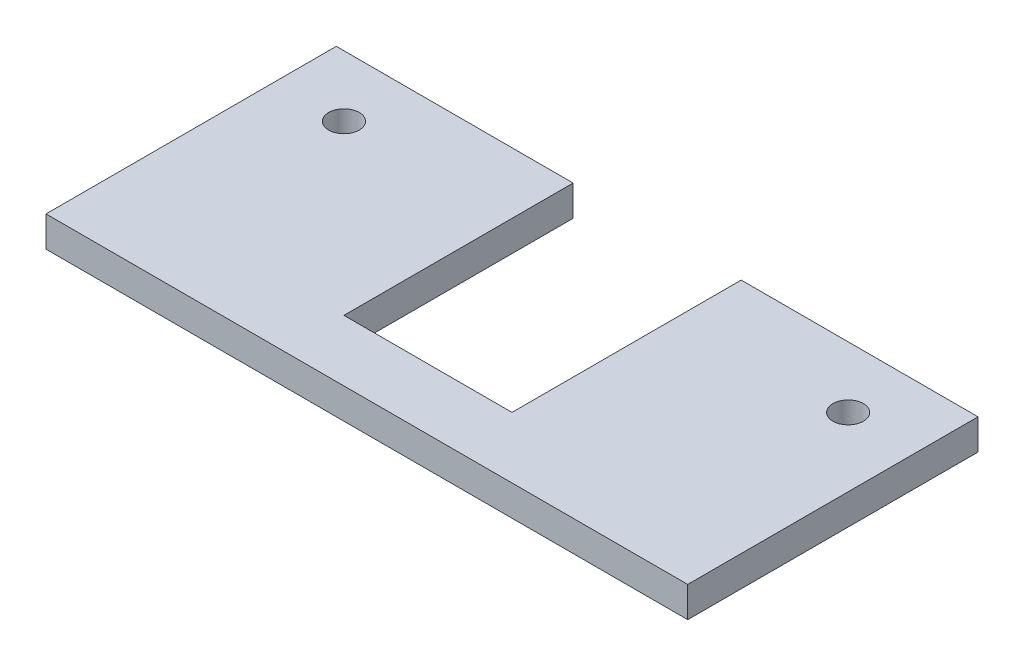
ISO-10303-21;
HEADER;
FILE_DESCRIPTION(('STEP AP214'),'2;1');
FILE_NAME('part.step','',(''),(''),'','','');
FILE_SCHEMA(('AUTOMOTIVE_DESIGN { 1 0 10303 214 1 1 1 1 }'));
ENDSEC;
DATA;
#1=APPLICATION_CONTEXT('core data for automotive mechanical design processes');
#2=APPLICATION_PROTOCOL_DEFINITION('international standard','automotive_design',2000,#1);
#3=PRODUCT_CONTEXT('',#1,'mechanical');
#4=PRODUCT('Part','Part','',(#3));
#5=PRODUCT_RELATED_PRODUCT_CATEGORY('part','',(#4));
#6=PRODUCT_DEFINITION_FORMATION('','',#4);
#7=PRODUCT_DEFINITION_CONTEXT('part definition',#1,'design');
#8=PRODUCT_DEFINITION('design','',#6,#7);
#9=PRODUCT_DEFINITION_SHAPE('','',#8);
#10=(LENGTH_UNIT() NAMED_UNIT(*) SI_UNIT(.MILLI.,.METRE.));
#11=(NAMED_UNIT(*) PLANE_ANGLE_UNIT() SI_UNIT($,.RADIAN.));
#12=(NAMED_UNIT(*) SI_UNIT($,.STERADIAN.) SOLID_ANGLE_UNIT());
#13=UNCERTAINTY_MEASURE_WITH_UNIT(LENGTH_MEASURE(1.E-05),#10,'distance_accuracy_value','');
#14=(GEOMETRIC_REPRESENTATION_CONTEXT(3) GLOBAL_UNCERTAINTY_ASSIGNED_CONTEXT((#13)) GLOBAL_UNIT_ASSIGNED_CONTEXT((#10,
#11,#12)) REPRESENTATION_CONTEXT('',''));
#15=CARTESIAN_POINT('',(0.,0.,0.));
#16=DIRECTION('',(0.,0.,1.));
#17=DIRECTION('',(1.,0.,0.));
#18=AXIS2_PLACEMENT_3D('',#15,#16,#17);
#19=CARTESIAN_POINT('',(0.,2.,0.));
#20=DIRECTION('',(0.,1.,0.));
#21=DIRECTION('',(0.,0.,1.));
#22=AXIS2_PLACEMENT_3D('',#19,#20,#21);
#23=PLANE('',#22);
#24=CARTESIAN_POINT('',(0.,2.,0.));
#25=DIRECTION('',(0.,1.,0.));
#26=DIRECTION('',(0.,0.,1.));
#27=AXIS2_PLACEMENT_3D('',#24,#25,#26);
#28=CIRCLE('',#27,1.);
#29=CARTESIAN_POINT('',(0.,2.,1.));
#30=VERTEX_POINT('',#29);
#31=EDGE_CURVE('E139',#30,#30,#28,.T.);
#32=ORIENTED_EDGE('',*,*,#31,.F.);
#33=EDGE_LOOP('',(#32));
#34=FACE_BOUND('',#33,.T.);
#35=DIRECTION('',(0.,0.,-1.));
#36=VECTOR('',#35,1.);
#37=CARTESIAN_POINT('',(11.,2.,0.));
#38=LINE('',#37,#36);
#39=CARTESIAN_POINT('',(11.,2.,11.));
#40=VERTEX_POINT('',#39);
#41=CARTESIAN_POINT('',(11.,2.,-4.));
#42=VERTEX_POINT('',#41);
#43=EDGE_CURVE('E52',#40,#42,#38,.T.);
#44=ORIENTED_EDGE('',*,*,#43,.T.);
#45=DIRECTION('',(-1.,0.,0.));
#46=VECTOR('',#45,1.);
#47=CARTESIAN_POINT('',(11.,2.,-4.));
#48=LINE('',#47,#46);
#49=CARTESIAN_POINT('',(-4.5,2.,-4.));
#50=VERTEX_POINT('',#49);
#51=EDGE_CURVE('E95',#42,#50,#48,.T.);
#52=ORIENTED_EDGE('',*,*,#51,.T.);
#53=DIRECTION('',(0.,0.,1.));
#54=VECTOR('',#53,1.);
#55=CARTESIAN_POINT('',(-4.5,2.,-4.));
#56=LINE('',#55,#54);
#57=CARTESIAN_POINT('',(-4.5,2.,15.));
#58=VERTEX_POINT('',#57);
#59=EDGE_CURVE('E164',#50,#58,#56,.T.);
#60=ORIENTED_EDGE('',*,*,#59,.T.);
#61=DIRECTION('',(1.,0.,0.));
#62=VECTOR('',#61,1.);
#63=CARTESIAN_POINT('',(-4.5,2.,15.));
#64=LINE('',#63,#62);
#65=CARTESIAN_POINT('',(37.5,2.,15.));
#66=VERTEX_POINT('',#65);
#67=EDGE_CURVE('E178',#58,#66,#64,.T.);
#68=ORIENTED_EDGE('',*,*,#67,.T.);
#69=DIRECTION('',(0.,0.,-1.));
#70=VECTOR('',#69,1.);
#71=CARTESIAN_POINT('',(37.5,2.,15.));
#72=LINE('',#71,#70);
#73=CARTESIAN_POINT('',(37.5,2.,-4.));
#74=VERTEX_POINT('',#73);
#75=EDGE_CURVE('E115',#66,#74,#72,.T.);
#76=ORIENTED_EDGE('',*,*,#75,.T.);
#77=DIRECTION('',(-1.,0.,0.));
#78=VECTOR('',#77,1.);
#79=CARTESIAN_POINT('',(37.5,2.,-4.));
#80=LINE('',#79,#78);
#81=CARTESIAN_POINT('',(22.,2.,-4.));
#82=VERTEX_POINT('',#81);
#83=EDGE_CURVE('E109',#74,#82,#80,.T.);
#84=ORIENTED_EDGE('',*,*,#83,.T.);
#85=DIRECTION('',(0.,0.,1.));
#86=VECTOR('',#85,1.);
#87=CARTESIAN_POINT('',(22.,2.,-4.));
#88=LINE('',#87,#86);
#89=CARTESIAN_POINT('',(22.,2.,11.));
#90=VERTEX_POINT('',#89);
#91=EDGE_CURVE('E113',#82,#90,#88,.T.);
#92=ORIENTED_EDGE('',*,*,#91,.T.);
#93=DIRECTION('',(-1.,0.,0.));
#94=VECTOR('',#93,1.);
#95=CARTESIAN_POINT('',(11.,2.,11.));
#96=LINE('',#95,#94);
#97=EDGE_CURVE('E130',#90,#40,#96,.T.);
#98=ORIENTED_EDGE('',*,*,#97,.T.);
#99=EDGE_LOOP('',(#44,#52,#60,#68,#76,#84,#92,#98));
#100=FACE_BOUND('',#99,.T.);
#101=CARTESIAN_POINT('',(33.,2.,0.));
#102=DIRECTION('',(0.,1.,0.));
#103=DIRECTION('',(0.,0.,1.));
#104=AXIS2_PLACEMENT_3D('',#101,#102,#103);
#105=CIRCLE('',#104,0.999999999999998);
#106=CARTESIAN_POINT('',(33.,2.,0.999999999999998));
#107=VERTEX_POINT('',#106);
#108=EDGE_CURVE('E187',#107,#107,#105,.T.);
#109=ORIENTED_EDGE('',*,*,#108,.F.);
#110=EDGE_LOOP('',(#109));
#111=FACE_BOUND('',#110,.T.);
#112=ADVANCED_FACE('F35',(#34,#100,#111),#23,.T.);
#113=CARTESIAN_POINT('',(0.,0.,0.));
#114=DIRECTION('',(0.,1.,0.));
#115=DIRECTION('',(0.,0.,1.));
#116=AXIS2_PLACEMENT_3D('',#113,#114,#115);
#117=PLANE('',#116);
#118=CARTESIAN_POINT('',(0.,0.,0.));
#119=DIRECTION('',(0.,1.,0.));
#120=DIRECTION('',(0.,0.,1.));
#121=AXIS2_PLACEMENT_3D('',#118,#119,#120);
#122=CIRCLE('',#121,1.);
#123=CARTESIAN_POINT('',(0.,0.,1.));
#124=VERTEX_POINT('',#123);
#125=EDGE_CURVE('E184',#124,#124,#122,.T.);
#126=ORIENTED_EDGE('',*,*,#125,.T.);
#127=EDGE_LOOP('',(#126));
#128=FACE_BOUND('',#127,.T.);
#129=DIRECTION('',(-1.,0.,0.));
#130=VECTOR('',#129,1.);
#131=CARTESIAN_POINT('',(11.,0.,-4.));
#132=LINE('',#131,#130);
#133=CARTESIAN_POINT('',(11.,0.,-4.));
#134=VERTEX_POINT('',#133);
#135=CARTESIAN_POINT('',(-4.5,0.,-4.));
#136=VERTEX_POINT('',#135);
#137=EDGE_CURVE('E136',#134,#136,#132,.T.);
#138=ORIENTED_EDGE('',*,*,#137,.F.);
#139=DIRECTION('',(0.,0.,-1.));
#140=VECTOR('',#139,1.);
#141=CARTESIAN_POINT('',(11.,0.,0.));
#142=LINE('',#141,#140);
#143=CARTESIAN_POINT('',(11.,0.,11.));
#144=VERTEX_POINT('',#143);
#145=EDGE_CURVE('E148',#144,#134,#142,.T.);
#146=ORIENTED_EDGE('',*,*,#145,.F.);
#147=DIRECTION('',(-1.,0.,0.));
#148=VECTOR('',#147,1.);
#149=CARTESIAN_POINT('',(11.,0.,11.));
#150=LINE('',#149,#148);
#151=CARTESIAN_POINT('',(22.,0.,11.));
#152=VERTEX_POINT('',#151);
#153=EDGE_CURVE('E88',#152,#144,#150,.T.);
#154=ORIENTED_EDGE('',*,*,#153,.F.);
#155=DIRECTION('',(0.,0.,1.));
#156=VECTOR('',#155,1.);
#157=CARTESIAN_POINT('',(22.,0.,11.));
#158=LINE('',#157,#156);
#159=CARTESIAN_POINT('',(22.,0.,-4.));
#160=VERTEX_POINT('',#159);
#161=EDGE_CURVE('E81',#160,#152,#158,.T.);
#162=ORIENTED_EDGE('',*,*,#161,.F.);
#163=DIRECTION('',(-1.,0.,0.));
#164=VECTOR('',#163,1.);
#165=CARTESIAN_POINT('',(37.5,0.,-4.));
#166=LINE('',#165,#164);
#167=CARTESIAN_POINT('',(37.5,0.,-4.));
#168=VERTEX_POINT('',#167);
#169=EDGE_CURVE('E124',#168,#160,#166,.T.);
#170=ORIENTED_EDGE('',*,*,#169,.F.);
#171=DIRECTION('',(0.,0.,-1.));
#172=VECTOR('',#171,1.);
#173=CARTESIAN_POINT('',(37.5,0.,15.));
#174=LINE('',#173,#172);
#175=CARTESIAN_POINT('',(37.5,0.,15.));
#176=VERTEX_POINT('',#175);
#177=EDGE_CURVE('E143',#176,#168,#174,.T.);
#178=ORIENTED_EDGE('',*,*,#177,.F.);
#179=DIRECTION('',(1.,0.,0.));
#180=VECTOR('',#179,1.);
#181=CARTESIAN_POINT('',(-4.5,0.,15.));
#182=LINE('',#181,#180);
#183=CARTESIAN_POINT('',(-4.5,0.,15.));
#184=VERTEX_POINT('',#183);
#185=EDGE_CURVE('E141',#184,#176,#182,.T.);
#186=ORIENTED_EDGE('',*,*,#185,.F.);
#187=DIRECTION('',(0.,0.,1.));
#188=VECTOR('',#187,1.);
#189=CARTESIAN_POINT('',(-4.5,0.,-4.));
#190=LINE('',#189,#188);
#191=EDGE_CURVE('E138',#136,#184,#190,.T.);
#192=ORIENTED_EDGE('',*,*,#191,.F.);
#193=EDGE_LOOP('',(#138,#146,#154,#162,#170,#178,#186,#192));
#194=FACE_BOUND('',#193,.T.);
#195=CARTESIAN_POINT('',(33.,0.,0.));
#196=DIRECTION('',(0.,1.,0.));
#197=DIRECTION('',(0.,0.,1.));
#198=AXIS2_PLACEMENT_3D('',#195,#196,#197);
#199=CIRCLE('',#198,0.999999999999998);
#200=CARTESIAN_POINT('',(33.,0.,0.999999999999998));
#201=VERTEX_POINT('',#200);
#202=EDGE_CURVE('E190',#201,#201,#199,.T.);
#203=ORIENTED_EDGE('',*,*,#202,.T.);
#204=EDGE_LOOP('',(#203));
#205=FACE_BOUND('',#204,.T.);
#206=ADVANCED_FACE('F168',(#128,#194,#205),#117,.F.);
#207=CARTESIAN_POINT('',(11.,2.,-4.));
#208=DIRECTION('',(0.,0.,1.));
#209=DIRECTION('',(1.,0.,0.));
#210=AXIS2_PLACEMENT_3D('',#207,#208,#209);
#211=PLANE('',#210);
#212=ORIENTED_EDGE('',*,*,#137,.T.);
#213=DIRECTION('',(0.,-1.,0.));
#214=VECTOR('',#213,1.);
#215=CARTESIAN_POINT('',(-4.5,2.,-4.));
#216=LINE('',#215,#214);
#217=EDGE_CURVE('E44',#50,#136,#216,.T.);
#218=ORIENTED_EDGE('',*,*,#217,.F.);
#219=ORIENTED_EDGE('',*,*,#51,.F.);
#220=DIRECTION('',(0.,-1.,0.));
#221=VECTOR('',#220,1.);
#222=CARTESIAN_POINT('',(11.,2.,-4.));
#223=LINE('',#222,#221);
#224=EDGE_CURVE('E11',#42,#134,#223,.T.);
#225=ORIENTED_EDGE('',*,*,#224,.T.);
#226=EDGE_LOOP('',(#212,#218,#219,#225));
#227=FACE_BOUND('',#226,.T.);
#228=ADVANCED_FACE('F37',(#227),#211,.F.);
#229=CARTESIAN_POINT('',(-4.5,2.,-4.));
#230=DIRECTION('',(1.,0.,0.));
#231=DIRECTION('',(0.,0.,-1.));
#232=AXIS2_PLACEMENT_3D('',#229,#230,#231);
#233=PLANE('',#232);
#234=ORIENTED_EDGE('',*,*,#191,.T.);
#235=DIRECTION('',(0.,-1.,0.));
#236=VECTOR('',#235,1.);
#237=CARTESIAN_POINT('',(-4.5,2.,15.));
#238=LINE('',#237,#236);
#239=EDGE_CURVE('E156',#58,#184,#238,.T.);
#240=ORIENTED_EDGE('',*,*,#239,.F.);
#241=ORIENTED_EDGE('',*,*,#59,.F.);
#242=ORIENTED_EDGE('',*,*,#217,.T.);
#243=EDGE_LOOP('',(#234,#240,#241,#242));
#244=FACE_BOUND('',#243,.T.);
#245=ADVANCED_FACE('F162',(#244),#233,.F.);
#246=CARTESIAN_POINT('',(-4.5,2.,15.));
#247=DIRECTION('',(0.,0.,-1.));
#248=DIRECTION('',(-1.,0.,0.));
#249=AXIS2_PLACEMENT_3D('',#246,#247,#248);
#250=PLANE('',#249);
#251=ORIENTED_EDGE('',*,*,#185,.T.);
#252=DIRECTION('',(0.,-1.,0.));
#253=VECTOR('',#252,1.);
#254=CARTESIAN_POINT('',(37.5,2.,15.));
#255=LINE('',#254,#253);
#256=EDGE_CURVE('E153',#66,#176,#255,.T.);
#257=ORIENTED_EDGE('',*,*,#256,.F.);
#258=ORIENTED_EDGE('',*,*,#67,.F.);
#259=ORIENTED_EDGE('',*,*,#239,.T.);
#260=EDGE_LOOP('',(#251,#257,#258,#259));
#261=FACE_BOUND('',#260,.T.);
#262=ADVANCED_FACE('F174',(#261),#250,.F.);
#263=CARTESIAN_POINT('',(37.5,2.,15.));
#264=DIRECTION('',(-1.,0.,0.));
#265=DIRECTION('',(0.,0.,1.));
#266=AXIS2_PLACEMENT_3D('',#263,#264,#265);
#267=PLANE('',#266);
#268=ORIENTED_EDGE('',*,*,#177,.T.);
#269=DIRECTION('',(0.,-1.,0.));
#270=VECTOR('',#269,1.);
#271=CARTESIAN_POINT('',(37.5,2.,-4.));
#272=LINE('',#271,#270);
#273=EDGE_CURVE('E125',#74,#168,#272,.T.);
#274=ORIENTED_EDGE('',*,*,#273,.F.);
#275=ORIENTED_EDGE('',*,*,#75,.F.);
#276=ORIENTED_EDGE('',*,*,#256,.T.);
#277=EDGE_LOOP('',(#268,#274,#275,#276));
#278=FACE_BOUND('',#277,.T.);
#279=ADVANCED_FACE('F177',(#278),#267,.F.);
#280=CARTESIAN_POINT('',(37.5,2.,-4.));
#281=DIRECTION('',(0.,0.,1.));
#282=DIRECTION('',(1.,0.,0.));
#283=AXIS2_PLACEMENT_3D('',#280,#281,#282);
#284=PLANE('',#283);
#285=ORIENTED_EDGE('',*,*,#169,.T.);
#286=DIRECTION('',(0.,-1.,0.));
#287=VECTOR('',#286,1.);
#288=CARTESIAN_POINT('',(22.,2.,-4.));
#289=LINE('',#288,#287);
#290=EDGE_CURVE('E121',#82,#160,#289,.T.);
#291=ORIENTED_EDGE('',*,*,#290,.F.);
#292=ORIENTED_EDGE('',*,*,#83,.F.);
#293=ORIENTED_EDGE('',*,*,#273,.T.);
#294=EDGE_LOOP('',(#285,#291,#292,#293));
#295=FACE_BOUND('',#294,.T.);
#296=ADVANCED_FACE('F122',(#295),#284,.F.);
#297=CARTESIAN_POINT('',(22.,2.,11.));
#298=DIRECTION('',(1.,0.,0.));
#299=DIRECTION('',(0.,0.,-1.));
#300=AXIS2_PLACEMENT_3D('',#297,#298,#299);
#301=PLANE('',#300);
#302=ORIENTED_EDGE('',*,*,#161,.T.);
#303=DIRECTION('',(0.,-1.,0.));
#304=VECTOR('',#303,1.);
#305=CARTESIAN_POINT('',(22.,2.,11.));
#306=LINE('',#305,#304);
#307=EDGE_CURVE('E126',#90,#152,#306,.T.);
#308=ORIENTED_EDGE('',*,*,#307,.F.);
#309=ORIENTED_EDGE('',*,*,#91,.F.);
#310=ORIENTED_EDGE('',*,*,#290,.T.);
#311=EDGE_LOOP('',(#302,#308,#309,#310));
#312=FACE_BOUND('',#311,.T.);
#313=ADVANCED_FACE('F128',(#312),#301,.F.);
#314=CARTESIAN_POINT('',(11.,2.,11.));
#315=DIRECTION('',(0.,0.,1.));
#316=DIRECTION('',(1.,0.,0.));
#317=AXIS2_PLACEMENT_3D('',#314,#315,#316);
#318=PLANE('',#317);
#319=ORIENTED_EDGE('',*,*,#153,.T.);
#320=DIRECTION('',(0.,-1.,0.));
#321=VECTOR('',#320,1.);
#322=CARTESIAN_POINT('',(11.,2.,11.));
#323=LINE('',#322,#321);
#324=EDGE_CURVE('E132',#40,#144,#323,.T.);
#325=ORIENTED_EDGE('',*,*,#324,.F.);
#326=ORIENTED_EDGE('',*,*,#97,.F.);
#327=ORIENTED_EDGE('',*,*,#307,.T.);
#328=EDGE_LOOP('',(#319,#325,#326,#327));
#329=FACE_BOUND('',#328,.T.);
#330=ADVANCED_FACE('F214',(#329),#318,.F.);
#331=CARTESIAN_POINT('',(11.,2.,0.));
#332=DIRECTION('',(-1.,0.,0.));
#333=DIRECTION('',(0.,0.,1.));
#334=AXIS2_PLACEMENT_3D('',#331,#332,#333);
#335=PLANE('',#334);
#336=ORIENTED_EDGE('',*,*,#145,.T.);
#337=ORIENTED_EDGE('',*,*,#224,.F.);
#338=ORIENTED_EDGE('',*,*,#43,.F.);
#339=ORIENTED_EDGE('',*,*,#324,.T.);
#340=EDGE_LOOP('',(#336,#337,#338,#339));
#341=FACE_BOUND('',#340,.T.);
#342=ADVANCED_FACE('F211',(#341),#335,.F.);
#343=CARTESIAN_POINT('',(0.,2.,0.));
#344=DIRECTION('',(0.,-1.,0.));
#345=DIRECTION('',(0.,0.,-1.));
#346=AXIS2_PLACEMENT_3D('',#343,#344,#345);
#347=CYLINDRICAL_SURFACE('',#346,1.);
#348=ORIENTED_EDGE('',*,*,#31,.T.);
#349=EDGE_LOOP('',(#348));
#350=FACE_BOUND('',#349,.T.);
#351=ORIENTED_EDGE('',*,*,#125,.F.);
#352=EDGE_LOOP('',(#351));
#353=FACE_BOUND('',#352,.T.);
#354=ADVANCED_FACE('F208',(#350,#353),#347,.F.);
#355=CARTESIAN_POINT('',(33.,2.,0.));
#356=DIRECTION('',(0.,-1.,0.));
#357=DIRECTION('',(0.,0.,-1.));
#358=AXIS2_PLACEMENT_3D('',#355,#356,#357);
#359=CYLINDRICAL_SURFACE('',#358,0.999999999999998);
#360=ORIENTED_EDGE('',*,*,#108,.T.);
#361=EDGE_LOOP('',(#360));
#362=FACE_BOUND('',#361,.T.);
#363=ORIENTED_EDGE('',*,*,#202,.F.);
#364=EDGE_LOOP('',(#363));
#365=FACE_BOUND('',#364,.T.);
#366=ADVANCED_FACE('F196',(#362,#365),#359,.F.);
#367=CLOSED_SHELL('',(#112,#206,#228,#245,#262,#279,#296,#313,#330,#342,#354,#366));
#368=MANIFOLD_SOLID_BREP('B2',#367);
#369=ADVANCED_BREP_SHAPE_REPRESENTATION('',(#18,#368),#14);
#370=SHAPE_DEFINITION_REPRESENTATION(#9,#369);
ENDSEC;
END-ISO-10303-21;
